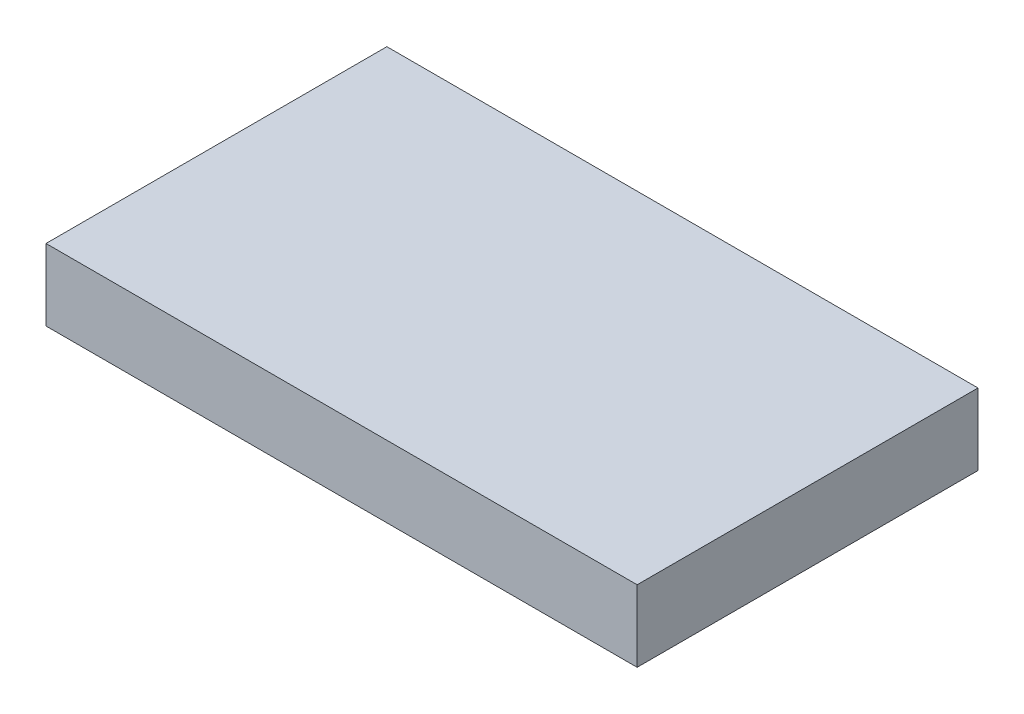
ISO-10303-21;
HEADER;
FILE_DESCRIPTION(('STEP AP214'),'2;1');
FILE_NAME('part.step','',(''),(''),'','','');
FILE_SCHEMA(('AUTOMOTIVE_DESIGN { 1 0 10303 214 1 1 1 1 }'));
ENDSEC;
DATA;
#1=APPLICATION_CONTEXT('core data for automotive mechanical design processes');
#2=APPLICATION_PROTOCOL_DEFINITION('international standard','automotive_design',2000,#1);
#3=PRODUCT_CONTEXT('',#1,'mechanical');
#4=PRODUCT('Part','Part','',(#3));
#5=PRODUCT_RELATED_PRODUCT_CATEGORY('part','',(#4));
#6=PRODUCT_DEFINITION_FORMATION('','',#4);
#7=PRODUCT_DEFINITION_CONTEXT('part definition',#1,'design');
#8=PRODUCT_DEFINITION('design','',#6,#7);
#9=PRODUCT_DEFINITION_SHAPE('','',#8);
#10=(LENGTH_UNIT() NAMED_UNIT(*) SI_UNIT(.MILLI.,.METRE.));
#11=(NAMED_UNIT(*) PLANE_ANGLE_UNIT() SI_UNIT($,.RADIAN.));
#12=(NAMED_UNIT(*) SI_UNIT($,.STERADIAN.) SOLID_ANGLE_UNIT());
#13=UNCERTAINTY_MEASURE_WITH_UNIT(LENGTH_MEASURE(1.E-05),#10,'distance_accuracy_value','');
#14=(GEOMETRIC_REPRESENTATION_CONTEXT(3) GLOBAL_UNCERTAINTY_ASSIGNED_CONTEXT((#13)) GLOBAL_UNIT_ASSIGNED_CONTEXT((#10,
#11,#12)) REPRESENTATION_CONTEXT('',''));
#15=CARTESIAN_POINT('',(0.,0.,0.));
#16=DIRECTION('',(0.,0.,1.));
#17=DIRECTION('',(1.,0.,0.));
#18=AXIS2_PLACEMENT_3D('',#15,#16,#17);
#19=CARTESIAN_POINT('',(-28.4953642384106,3.,-7.54370860927153));
#20=DIRECTION('',(1.,0.,0.));
#21=DIRECTION('',(0.,0.,-1.));
#22=AXIS2_PLACEMENT_3D('',#19,#20,#21);
#23=PLANE('',#22);
#24=DIRECTION('',(0.,0.,1.));
#25=VECTOR('',#24,1.);
#26=CARTESIAN_POINT('',(-28.4953642384106,0.,-7.54370860927153));
#27=LINE('',#26,#25);
#28=CARTESIAN_POINT('',(-28.4953642384106,0.,-21.8437086092715));
#29=VERTEX_POINT('',#28);
#30=CARTESIAN_POINT('',(-28.4953642384106,0.,-7.54370860927153));
#31=VERTEX_POINT('',#30);
#32=EDGE_CURVE('E99',#29,#31,#27,.T.);
#33=ORIENTED_EDGE('',*,*,#32,.T.);
#34=DIRECTION('',(0.,-1.,0.));
#35=VECTOR('',#34,1.);
#36=CARTESIAN_POINT('',(-28.4953642384106,3.,-7.54370860927153));
#37=LINE('',#36,#35);
#38=CARTESIAN_POINT('',(-28.4953642384106,3.,-7.54370860927153));
#39=VERTEX_POINT('',#38);
#40=EDGE_CURVE('E11',#39,#31,#37,.T.);
#41=ORIENTED_EDGE('',*,*,#40,.F.);
#42=DIRECTION('',(0.,0.,1.));
#43=VECTOR('',#42,1.);
#44=CARTESIAN_POINT('',(-28.4953642384106,3.,-7.54370860927153));
#45=LINE('',#44,#43);
#46=CARTESIAN_POINT('',(-28.4953642384106,3.,-21.8437086092715));
#47=VERTEX_POINT('',#46);
#48=EDGE_CURVE('E87',#47,#39,#45,.T.);
#49=ORIENTED_EDGE('',*,*,#48,.F.);
#50=DIRECTION('',(0.,-1.,0.));
#51=VECTOR('',#50,1.);
#52=CARTESIAN_POINT('',(-28.4953642384106,3.,-21.8437086092715));
#53=LINE('',#52,#51);
#54=EDGE_CURVE('E95',#47,#29,#53,.T.);
#55=ORIENTED_EDGE('',*,*,#54,.T.);
#56=EDGE_LOOP('',(#33,#41,#49,#55));
#57=FACE_BOUND('',#56,.T.);
#58=ADVANCED_FACE('F36',(#57),#23,.F.);
#59=CARTESIAN_POINT('',(-28.4953642384106,3.,-7.54370860927153));
#60=DIRECTION('',(0.,0.,-1.));
#61=DIRECTION('',(-1.,0.,0.));
#62=AXIS2_PLACEMENT_3D('',#59,#60,#61);
#63=PLANE('',#62);
#64=DIRECTION('',(1.,0.,0.));
#65=VECTOR('',#64,1.);
#66=CARTESIAN_POINT('',(-28.4953642384106,0.,-7.54370860927153));
#67=LINE('',#66,#65);
#68=CARTESIAN_POINT('',(-3.69536423841061,0.,-7.54370860927153));
#69=VERTEX_POINT('',#68);
#70=EDGE_CURVE('E91',#31,#69,#67,.T.);
#71=ORIENTED_EDGE('',*,*,#70,.T.);
#72=DIRECTION('',(0.,-1.,0.));
#73=VECTOR('',#72,1.);
#74=CARTESIAN_POINT('',(-3.69536423841061,3.,-7.54370860927153));
#75=LINE('',#74,#73);
#76=CARTESIAN_POINT('',(-3.69536423841061,3.,-7.54370860927153));
#77=VERTEX_POINT('',#76);
#78=EDGE_CURVE('E44',#77,#69,#75,.T.);
#79=ORIENTED_EDGE('',*,*,#78,.F.);
#80=DIRECTION('',(1.,0.,0.));
#81=VECTOR('',#80,1.);
#82=CARTESIAN_POINT('',(-28.4953642384106,3.,-7.54370860927153));
#83=LINE('',#82,#81);
#84=EDGE_CURVE('E82',#39,#77,#83,.T.);
#85=ORIENTED_EDGE('',*,*,#84,.F.);
#86=ORIENTED_EDGE('',*,*,#40,.T.);
#87=EDGE_LOOP('',(#71,#79,#85,#86));
#88=FACE_BOUND('',#87,.T.);
#89=ADVANCED_FACE('F90',(#88),#63,.F.);
#90=CARTESIAN_POINT('',(-3.69536423841061,3.,-7.54370860927153));
#91=DIRECTION('',(-1.,0.,0.));
#92=DIRECTION('',(0.,0.,1.));
#93=AXIS2_PLACEMENT_3D('',#90,#91,#92);
#94=PLANE('',#93);
#95=DIRECTION('',(0.,0.,-1.));
#96=VECTOR('',#95,1.);
#97=CARTESIAN_POINT('',(-3.69536423841061,0.,-7.54370860927153));
#98=LINE('',#97,#96);
#99=CARTESIAN_POINT('',(-3.69536423841061,0.,-21.8437086092715));
#100=VERTEX_POINT('',#99);
#101=EDGE_CURVE('E69',#69,#100,#98,.T.);
#102=ORIENTED_EDGE('',*,*,#101,.T.);
#103=DIRECTION('',(0.,-1.,0.));
#104=VECTOR('',#103,1.);
#105=CARTESIAN_POINT('',(-3.69536423841061,3.,-21.8437086092715));
#106=LINE('',#105,#104);
#107=CARTESIAN_POINT('',(-3.69536423841061,3.,-21.8437086092715));
#108=VERTEX_POINT('',#107);
#109=EDGE_CURVE('E92',#108,#100,#106,.T.);
#110=ORIENTED_EDGE('',*,*,#109,.F.);
#111=DIRECTION('',(0.,0.,-1.));
#112=VECTOR('',#111,1.);
#113=CARTESIAN_POINT('',(-3.69536423841061,3.,-7.54370860927153));
#114=LINE('',#113,#112);
#115=EDGE_CURVE('E85',#77,#108,#114,.T.);
#116=ORIENTED_EDGE('',*,*,#115,.F.);
#117=ORIENTED_EDGE('',*,*,#78,.T.);
#118=EDGE_LOOP('',(#102,#110,#116,#117));
#119=FACE_BOUND('',#118,.T.);
#120=ADVANCED_FACE('F93',(#119),#94,.F.);
#121=CARTESIAN_POINT('',(-28.4953642384106,3.,-21.8437086092715));
#122=DIRECTION('',(0.,0.,1.));
#123=DIRECTION('',(1.,0.,0.));
#124=AXIS2_PLACEMENT_3D('',#121,#122,#123);
#125=PLANE('',#124);
#126=DIRECTION('',(-1.,0.,0.));
#127=VECTOR('',#126,1.);
#128=CARTESIAN_POINT('',(-28.4953642384106,0.,-21.8437086092715));
#129=LINE('',#128,#127);
#130=EDGE_CURVE('E75',#100,#29,#129,.T.);
#131=ORIENTED_EDGE('',*,*,#130,.T.);
#132=ORIENTED_EDGE('',*,*,#54,.F.);
#133=DIRECTION('',(-1.,0.,0.));
#134=VECTOR('',#133,1.);
#135=CARTESIAN_POINT('',(-28.4953642384106,3.,-21.8437086092715));
#136=LINE('',#135,#134);
#137=EDGE_CURVE('E52',#108,#47,#136,.T.);
#138=ORIENTED_EDGE('',*,*,#137,.F.);
#139=ORIENTED_EDGE('',*,*,#109,.T.);
#140=EDGE_LOOP('',(#131,#132,#138,#139));
#141=FACE_BOUND('',#140,.T.);
#142=ADVANCED_FACE('F106',(#141),#125,.F.);
#143=CARTESIAN_POINT('',(0.,3.,0.));
#144=DIRECTION('',(0.,-1.,0.));
#145=DIRECTION('',(0.,0.,-1.));
#146=AXIS2_PLACEMENT_3D('',#143,#144,#145);
#147=PLANE('',#146);
#148=ORIENTED_EDGE('',*,*,#48,.T.);
#149=ORIENTED_EDGE('',*,*,#84,.T.);
#150=ORIENTED_EDGE('',*,*,#115,.T.);
#151=ORIENTED_EDGE('',*,*,#137,.T.);
#152=EDGE_LOOP('',(#148,#149,#150,#151));
#153=FACE_BOUND('',#152,.T.);
#154=ADVANCED_FACE('F83',(#153),#147,.F.);
#155=CARTESIAN_POINT('',(0.,0.,0.));
#156=DIRECTION('',(0.,-1.,0.));
#157=DIRECTION('',(0.,0.,-1.));
#158=AXIS2_PLACEMENT_3D('',#155,#156,#157);
#159=PLANE('',#158);
#160=ORIENTED_EDGE('',*,*,#32,.F.);
#161=ORIENTED_EDGE('',*,*,#130,.F.);
#162=ORIENTED_EDGE('',*,*,#101,.F.);
#163=ORIENTED_EDGE('',*,*,#70,.F.);
#164=EDGE_LOOP('',(#160,#161,#162,#163));
#165=FACE_BOUND('',#164,.T.);
#166=ADVANCED_FACE('F109',(#165),#159,.T.);
#167=CLOSED_SHELL('',(#58,#89,#120,#142,#154,#166));
#168=MANIFOLD_SOLID_BREP('B2',#167);
#169=ADVANCED_BREP_SHAPE_REPRESENTATION('',(#18,#168),#14);
#170=SHAPE_DEFINITION_REPRESENTATION(#9,#169);
ENDSEC;
END-ISO-10303-21;
